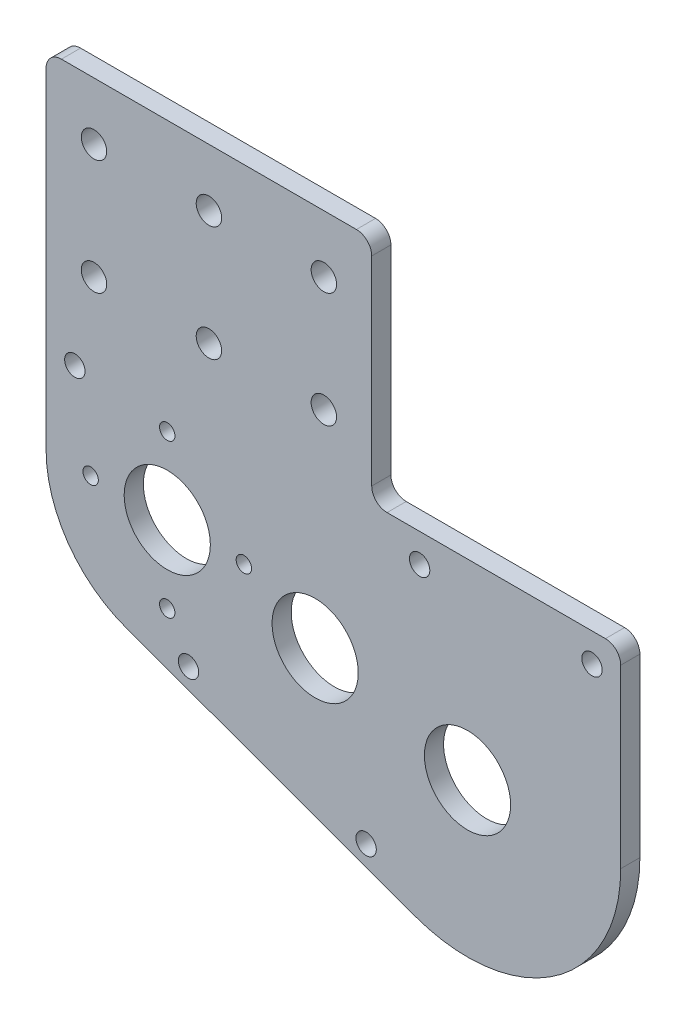
ISO-10303-21;
HEADER;
FILE_DESCRIPTION(('STEP AP214'),'2;1');
FILE_NAME('part.step','',(''),(''),'','','');
FILE_SCHEMA(('AUTOMOTIVE_DESIGN { 1 0 10303 214 1 1 1 1 }'));
ENDSEC;
DATA;
#1=APPLICATION_CONTEXT('core data for automotive mechanical design processes');
#2=APPLICATION_PROTOCOL_DEFINITION('international standard','automotive_design',2000,#1);
#3=PRODUCT_CONTEXT('',#1,'mechanical');
#4=PRODUCT('Part','Part','',(#3));
#5=PRODUCT_RELATED_PRODUCT_CATEGORY('part','',(#4));
#6=PRODUCT_DEFINITION_FORMATION('','',#4);
#7=PRODUCT_DEFINITION_CONTEXT('part definition',#1,'design');
#8=PRODUCT_DEFINITION('design','',#6,#7);
#9=PRODUCT_DEFINITION_SHAPE('','',#8);
#10=(LENGTH_UNIT() NAMED_UNIT(*) SI_UNIT(.MILLI.,.METRE.));
#11=(NAMED_UNIT(*) PLANE_ANGLE_UNIT() SI_UNIT($,.RADIAN.));
#12=(NAMED_UNIT(*) SI_UNIT($,.STERADIAN.) SOLID_ANGLE_UNIT());
#13=UNCERTAINTY_MEASURE_WITH_UNIT(LENGTH_MEASURE(1.E-05),#10,'distance_accuracy_value','');
#14=(GEOMETRIC_REPRESENTATION_CONTEXT(3) GLOBAL_UNCERTAINTY_ASSIGNED_CONTEXT((#13)) GLOBAL_UNIT_ASSIGNED_CONTEXT((#10,
#11,#12)) REPRESENTATION_CONTEXT('',''));
#15=CARTESIAN_POINT('',(0.,0.,0.));
#16=DIRECTION('',(0.,0.,1.));
#17=DIRECTION('',(1.,0.,0.));
#18=AXIS2_PLACEMENT_3D('',#15,#16,#17);
#19=CARTESIAN_POINT('',(50.8,63.5,6.35));
#20=DIRECTION('',(0.,1.,0.));
#21=DIRECTION('',(-1.,0.,0.));
#22=AXIS2_PLACEMENT_3D('',#19,#20,#21);
#23=PLANE('',#22);
#24=DIRECTION('',(-1.,0.,0.));
#25=VECTOR('',#24,1.);
#26=CARTESIAN_POINT('',(50.8,63.5,0.));
#27=LINE('',#26,#25);
#28=CARTESIAN_POINT('',(45.72,63.5,0.));
#29=VERTEX_POINT('',#28);
#30=CARTESIAN_POINT('',(-26.67,63.5,0.));
#31=VERTEX_POINT('',#30);
#32=EDGE_CURVE('E165',#29,#31,#27,.T.);
#33=ORIENTED_EDGE('',*,*,#32,.T.);
#34=DIRECTION('',(0.,0.,-1.));
#35=VECTOR('',#34,1.);
#36=CARTESIAN_POINT('',(-26.67,63.5,0.));
#37=LINE('',#36,#35);
#38=CARTESIAN_POINT('',(-26.67,63.5,6.35));
#39=VERTEX_POINT('',#38);
#40=EDGE_CURVE('E194',#39,#31,#37,.T.);
#41=ORIENTED_EDGE('',*,*,#40,.F.);
#42=DIRECTION('',(-1.,0.,0.));
#43=VECTOR('',#42,1.);
#44=CARTESIAN_POINT('',(50.8,63.5,6.35));
#45=LINE('',#44,#43);
#46=CARTESIAN_POINT('',(45.72,63.5,6.35));
#47=VERTEX_POINT('',#46);
#48=EDGE_CURVE('E141',#47,#39,#45,.T.);
#49=ORIENTED_EDGE('',*,*,#48,.F.);
#50=DIRECTION('',(0.,0.,-1.));
#51=VECTOR('',#50,1.);
#52=CARTESIAN_POINT('',(45.72,63.5,6.35));
#53=LINE('',#52,#51);
#54=EDGE_CURVE('E197',#29,#47,#53,.F.);
#55=ORIENTED_EDGE('',*,*,#54,.F.);
#56=EDGE_LOOP('',(#33,#41,#49,#55));
#57=FACE_BOUND('',#56,.T.);
#58=ADVANCED_FACE('F41',(#57),#23,.T.);
#59=CARTESIAN_POINT('',(50.8,63.5,6.35));
#60=DIRECTION('',(1.,0.,0.));
#61=DIRECTION('',(0.,0.,1.));
#62=AXIS2_PLACEMENT_3D('',#59,#60,#61);
#63=PLANE('',#62);
#64=DIRECTION('',(0.,1.,0.));
#65=VECTOR('',#64,1.);
#66=CARTESIAN_POINT('',(50.8,63.5,6.35));
#67=LINE('',#66,#65);
#68=CARTESIAN_POINT('',(50.8,0.,6.35));
#69=VERTEX_POINT('',#68);
#70=CARTESIAN_POINT('',(50.8,58.42,6.35));
#71=VERTEX_POINT('',#70);
#72=EDGE_CURVE('E176',#69,#71,#67,.T.);
#73=ORIENTED_EDGE('',*,*,#72,.F.);
#74=DIRECTION('',(0.,0.,-1.));
#75=VECTOR('',#74,1.);
#76=CARTESIAN_POINT('',(50.8,0.,6.35));
#77=LINE('',#76,#75);
#78=CARTESIAN_POINT('',(50.8,0.,0.));
#79=VERTEX_POINT('',#78);
#80=EDGE_CURVE('E177',#69,#79,#77,.T.);
#81=ORIENTED_EDGE('',*,*,#80,.T.);
#82=DIRECTION('',(0.,1.,0.));
#83=VECTOR('',#82,1.);
#84=CARTESIAN_POINT('',(50.8,63.5,0.));
#85=LINE('',#84,#83);
#86=CARTESIAN_POINT('',(50.8,58.42,0.));
#87=VERTEX_POINT('',#86);
#88=EDGE_CURVE('E162',#79,#87,#85,.T.);
#89=ORIENTED_EDGE('',*,*,#88,.T.);
#90=DIRECTION('',(0.,0.,-1.));
#91=VECTOR('',#90,1.);
#92=CARTESIAN_POINT('',(50.8,58.42,6.35));
#93=LINE('',#92,#91);
#94=EDGE_CURVE('E180',#71,#87,#93,.T.);
#95=ORIENTED_EDGE('',*,*,#94,.F.);
#96=EDGE_LOOP('',(#73,#81,#89,#95));
#97=FACE_BOUND('',#96,.T.);
#98=ADVANCED_FACE('F247',(#97),#63,.T.);
#99=CARTESIAN_POINT('',(0.,0.,6.35));
#100=DIRECTION('',(0.,0.,-1.));
#101=DIRECTION('',(1.,0.,0.));
#102=AXIS2_PLACEMENT_3D('',#99,#100,#101);
#103=CYLINDRICAL_SURFACE('',#102,50.8);
#104=CARTESIAN_POINT('',(0.,0.,0.));
#105=DIRECTION('',(0.,0.,1.));
#106=DIRECTION('',(-1.,0.,0.));
#107=AXIS2_PLACEMENT_3D('',#104,#105,#106);
#108=CIRCLE('',#107,50.8);
#109=CARTESIAN_POINT('',(-17.3899869073601,-47.7307904330302,0.));
#110=VERTEX_POINT('',#109);
#111=EDGE_CURVE('E174',#110,#79,#108,.T.);
#112=ORIENTED_EDGE('',*,*,#111,.T.);
#113=ORIENTED_EDGE('',*,*,#80,.F.);
#114=CARTESIAN_POINT('',(0.,0.,6.35));
#115=DIRECTION('',(0.,0.,1.));
#116=DIRECTION('',(-1.,0.,0.));
#117=AXIS2_PLACEMENT_3D('',#114,#115,#116);
#118=CIRCLE('',#117,50.8);
#119=CARTESIAN_POINT('',(-17.3899869073601,-47.7307904330302,6.35));
#120=VERTEX_POINT('',#119);
#121=EDGE_CURVE('E151',#120,#69,#118,.T.);
#122=ORIENTED_EDGE('',*,*,#121,.F.);
#123=DIRECTION('',(0.,0.,-1.));
#124=VECTOR('',#123,1.);
#125=CARTESIAN_POINT('',(-17.3899869073601,-47.7307904330302,6.35));
#126=LINE('',#125,#124);
#127=EDGE_CURVE('E181',#120,#110,#126,.T.);
#128=ORIENTED_EDGE('',*,*,#127,.T.);
#129=EDGE_LOOP('',(#112,#113,#122,#128));
#130=FACE_BOUND('',#129,.T.);
#131=ADVANCED_FACE('F251',(#130),#103,.T.);
#132=CARTESIAN_POINT('',(-17.3899869073601,-47.7307904330302,6.35));
#133=DIRECTION('',(-0.342322576916537,-0.939582488839176,0.));
#134=DIRECTION('',(0.939582488839177,-0.342322576916537,0.));
#135=AXIS2_PLACEMENT_3D('',#132,#133,#134);
#136=PLANE('',#135);
#137=DIRECTION('',(0.939582488839176,-0.342322576916537,0.));
#138=VECTOR('',#137,1.);
#139=CARTESIAN_POINT('',(-17.3899869073601,-47.7307904330302,0.));
#140=LINE('',#139,#138);
#141=CARTESIAN_POINT('',(-113.286645892622,-12.7923025286006,0.));
#142=VERTEX_POINT('',#141);
#143=EDGE_CURVE('E172',#142,#110,#140,.T.);
#144=ORIENTED_EDGE('',*,*,#143,.T.);
#145=ORIENTED_EDGE('',*,*,#127,.F.);
#146=DIRECTION('',(0.939582488839176,-0.342322576916537,0.));
#147=VECTOR('',#146,1.);
#148=CARTESIAN_POINT('',(-17.3899869073601,-47.7307904330302,6.35));
#149=LINE('',#148,#147);
#150=CARTESIAN_POINT('',(-113.286645892622,-12.7923025286006,6.35));
#151=VERTEX_POINT('',#150);
#152=EDGE_CURVE('E156',#151,#120,#149,.T.);
#153=ORIENTED_EDGE('',*,*,#152,.F.);
#154=DIRECTION('',(0.,0.,-1.));
#155=VECTOR('',#154,1.);
#156=CARTESIAN_POINT('',(-113.286645892622,-12.7923025286006,6.35));
#157=LINE('',#156,#155);
#158=EDGE_CURVE('E150',#151,#142,#157,.T.);
#159=ORIENTED_EDGE('',*,*,#158,.T.);
#160=EDGE_LOOP('',(#144,#145,#153,#159));
#161=FACE_BOUND('',#160,.T.);
#162=ADVANCED_FACE('F255',(#161),#136,.T.);
#163=CARTESIAN_POINT('',(-99.5384357128441,24.9428,6.35));
#164=DIRECTION('',(0.,0.,-1.));
#165=DIRECTION('',(1.,0.,0.));
#166=AXIS2_PLACEMENT_3D('',#163,#164,#165);
#167=CYLINDRICAL_SURFACE('',#166,40.1615642871559);
#168=CARTESIAN_POINT('',(-99.5384357128441,24.9428,0.));
#169=DIRECTION('',(0.,0.,1.));
#170=DIRECTION('',(-1.,0.,0.));
#171=AXIS2_PLACEMENT_3D('',#168,#169,#170);
#172=CIRCLE('',#171,40.1615642871559);
#173=CARTESIAN_POINT('',(-139.7,24.9428,0.));
#174=VERTEX_POINT('',#173);
#175=EDGE_CURVE('E170',#174,#142,#172,.T.);
#176=ORIENTED_EDGE('',*,*,#175,.T.);
#177=ORIENTED_EDGE('',*,*,#158,.F.);
#178=CARTESIAN_POINT('',(-99.5384357128441,24.9428,6.35));
#179=DIRECTION('',(0.,0.,1.));
#180=DIRECTION('',(-1.,0.,0.));
#181=AXIS2_PLACEMENT_3D('',#178,#179,#180);
#182=CIRCLE('',#181,40.1615642871559);
#183=CARTESIAN_POINT('',(-139.7,24.9428,6.35));
#184=VERTEX_POINT('',#183);
#185=EDGE_CURVE('E133',#184,#151,#182,.T.);
#186=ORIENTED_EDGE('',*,*,#185,.F.);
#187=DIRECTION('',(0.,0.,-1.));
#188=VECTOR('',#187,1.);
#189=CARTESIAN_POINT('',(-139.7,24.9428,6.35));
#190=LINE('',#189,#188);
#191=EDGE_CURVE('E144',#184,#174,#190,.T.);
#192=ORIENTED_EDGE('',*,*,#191,.T.);
#193=EDGE_LOOP('',(#176,#177,#186,#192));
#194=FACE_BOUND('',#193,.T.);
#195=ADVANCED_FACE('F153',(#194),#167,.T.);
#196=CARTESIAN_POINT('',(-139.7,24.9428,6.35));
#197=DIRECTION('',(-1.,0.,0.));
#198=DIRECTION('',(0.,-1.,0.));
#199=AXIS2_PLACEMENT_3D('',#196,#197,#198);
#200=PLANE('',#199);
#201=DIRECTION('',(0.,-1.,0.));
#202=VECTOR('',#201,1.);
#203=CARTESIAN_POINT('',(-139.7,24.9428,0.));
#204=LINE('',#203,#202);
#205=CARTESIAN_POINT('',(-139.7,134.62,0.));
#206=VERTEX_POINT('',#205);
#207=EDGE_CURVE('E147',#206,#174,#204,.T.);
#208=ORIENTED_EDGE('',*,*,#207,.T.);
#209=ORIENTED_EDGE('',*,*,#191,.F.);
#210=DIRECTION('',(0.,-1.,0.));
#211=VECTOR('',#210,1.);
#212=CARTESIAN_POINT('',(-139.7,24.9428,6.35));
#213=LINE('',#212,#211);
#214=CARTESIAN_POINT('',(-139.7,134.62,6.35));
#215=VERTEX_POINT('',#214);
#216=EDGE_CURVE('E128',#215,#184,#213,.T.);
#217=ORIENTED_EDGE('',*,*,#216,.F.);
#218=DIRECTION('',(0.,0.,-1.));
#219=VECTOR('',#218,1.);
#220=CARTESIAN_POINT('',(-139.7,134.62,6.35));
#221=LINE('',#220,#219);
#222=EDGE_CURVE('E211',#206,#215,#221,.F.);
#223=ORIENTED_EDGE('',*,*,#222,.F.);
#224=EDGE_LOOP('',(#208,#209,#217,#223));
#225=FACE_BOUND('',#224,.T.);
#226=ADVANCED_FACE('F145',(#225),#200,.T.);
#227=CARTESIAN_POINT('',(0.,0.,6.35));
#228=DIRECTION('',(0.,0.,1.));
#229=DIRECTION('',(-1.,0.,0.));
#230=AXIS2_PLACEMENT_3D('',#227,#228,#229);
#231=PLANE('',#230);
#232=CARTESIAN_POINT('',(-47.625,82.55,6.35));
#233=DIRECTION('',(0.,0.,-1.));
#234=DIRECTION('',(-1.,0.,0.));
#235=AXIS2_PLACEMENT_3D('',#232,#233,#234);
#236=CIRCLE('',#235,4.21640000000001);
#237=CARTESIAN_POINT('',(-51.8414,82.55,6.35));
#238=VERTEX_POINT('',#237);
#239=EDGE_CURVE('E307',#238,#238,#236,.F.);
#240=ORIENTED_EDGE('',*,*,#239,.F.);
#241=EDGE_LOOP('',(#240));
#242=FACE_BOUND('',#241,.T.);
#243=CARTESIAN_POINT('',(-85.725,82.55,6.35));
#244=DIRECTION('',(0.,0.,-1.));
#245=DIRECTION('',(-1.,0.,0.));
#246=AXIS2_PLACEMENT_3D('',#243,#244,#245);
#247=CIRCLE('',#246,4.21639999999999);
#248=CARTESIAN_POINT('',(-89.9414,82.55,6.35));
#249=VERTEX_POINT('',#248);
#250=EDGE_CURVE('E311',#249,#249,#247,.F.);
#251=ORIENTED_EDGE('',*,*,#250,.F.);
#252=EDGE_LOOP('',(#251));
#253=FACE_BOUND('',#252,.T.);
#254=CARTESIAN_POINT('',(-85.725,120.65,6.35));
#255=DIRECTION('',(0.,0.,-1.));
#256=DIRECTION('',(-1.,0.,0.));
#257=AXIS2_PLACEMENT_3D('',#254,#255,#256);
#258=CIRCLE('',#257,4.21639999999999);
#259=CARTESIAN_POINT('',(-89.9414,120.65,6.35));
#260=VERTEX_POINT('',#259);
#261=EDGE_CURVE('E315',#260,#260,#258,.F.);
#262=ORIENTED_EDGE('',*,*,#261,.F.);
#263=EDGE_LOOP('',(#262));
#264=FACE_BOUND('',#263,.T.);
#265=CARTESIAN_POINT('',(-123.825,82.55,6.35));
#266=DIRECTION('',(0.,0.,-1.));
#267=DIRECTION('',(-1.,0.,0.));
#268=AXIS2_PLACEMENT_3D('',#265,#266,#267);
#269=CIRCLE('',#268,4.21639999999999);
#270=CARTESIAN_POINT('',(-128.0414,82.55,6.35));
#271=VERTEX_POINT('',#270);
#272=EDGE_CURVE('E319',#271,#271,#269,.F.);
#273=ORIENTED_EDGE('',*,*,#272,.F.);
#274=EDGE_LOOP('',(#273));
#275=FACE_BOUND('',#274,.T.);
#276=CARTESIAN_POINT('',(-47.625,120.65,6.35));
#277=DIRECTION('',(0.,0.,-1.));
#278=DIRECTION('',(-1.,0.,0.));
#279=AXIS2_PLACEMENT_3D('',#276,#277,#278);
#280=CIRCLE('',#279,4.21640000000001);
#281=CARTESIAN_POINT('',(-51.8414,120.65,6.35));
#282=VERTEX_POINT('',#281);
#283=EDGE_CURVE('E323',#282,#282,#280,.F.);
#284=ORIENTED_EDGE('',*,*,#283,.F.);
#285=EDGE_LOOP('',(#284));
#286=FACE_BOUND('',#285,.T.);
#287=CARTESIAN_POINT('',(-123.825,120.65,6.35));
#288=DIRECTION('',(0.,0.,-1.));
#289=DIRECTION('',(-1.,0.,0.));
#290=AXIS2_PLACEMENT_3D('',#287,#288,#289);
#291=CIRCLE('',#290,4.21639999999999);
#292=CARTESIAN_POINT('',(-128.0414,120.65,6.35));
#293=VERTEX_POINT('',#292);
#294=EDGE_CURVE('E327',#293,#293,#291,.F.);
#295=ORIENTED_EDGE('',*,*,#294,.F.);
#296=EDGE_LOOP('',(#295));
#297=FACE_BOUND('',#296,.T.);
#298=CARTESIAN_POINT('',(-33.6126326232561,-35.061995487122,6.35));
#299=DIRECTION('',(0.,0.,1.));
#300=DIRECTION('',(1.,0.,0.));
#301=AXIS2_PLACEMENT_3D('',#298,#299,#300);
#302=CIRCLE('',#301,3.3782);
#303=CARTESIAN_POINT('',(-30.2344326232561,-35.061995487122,6.35));
#304=VERTEX_POINT('',#303);
#305=EDGE_CURVE('E331',#304,#304,#302,.T.);
#306=ORIENTED_EDGE('',*,*,#305,.F.);
#307=EDGE_LOOP('',(#306));
#308=FACE_BOUND('',#307,.T.);
#309=CARTESIAN_POINT('',(-92.482563874237,-13.6136321894695,6.35));
#310=DIRECTION('',(0.,0.,1.));
#311=DIRECTION('',(1.,0.,0.));
#312=AXIS2_PLACEMENT_3D('',#309,#310,#311);
#313=CIRCLE('',#312,3.3782);
#314=CARTESIAN_POINT('',(-89.104363874237,-13.6136321894695,6.35));
#315=VERTEX_POINT('',#314);
#316=EDGE_CURVE('E335',#315,#315,#313,.T.);
#317=ORIENTED_EDGE('',*,*,#316,.F.);
#318=EDGE_LOOP('',(#317));
#319=FACE_BOUND('',#318,.T.);
#320=CARTESIAN_POINT('',(-130.175,53.975,6.35));
#321=DIRECTION('',(0.,0.,1.));
#322=DIRECTION('',(1.,0.,0.));
#323=AXIS2_PLACEMENT_3D('',#320,#321,#322);
#324=CIRCLE('',#323,3.3782);
#325=CARTESIAN_POINT('',(-126.7968,53.975,6.35));
#326=VERTEX_POINT('',#325);
#327=EDGE_CURVE('E339',#326,#326,#324,.T.);
#328=ORIENTED_EDGE('',*,*,#327,.F.);
#329=EDGE_LOOP('',(#328));
#330=FACE_BOUND('',#329,.T.);
#331=CARTESIAN_POINT('',(-15.875,53.975,6.35));
#332=DIRECTION('',(0.,0.,1.));
#333=DIRECTION('',(1.,0.,0.));
#334=AXIS2_PLACEMENT_3D('',#331,#332,#333);
#335=CIRCLE('',#334,3.3782);
#336=CARTESIAN_POINT('',(-12.4968,53.975,6.35));
#337=VERTEX_POINT('',#336);
#338=EDGE_CURVE('E343',#337,#337,#335,.T.);
#339=ORIENTED_EDGE('',*,*,#338,.F.);
#340=EDGE_LOOP('',(#339));
#341=FACE_BOUND('',#340,.T.);
#342=CARTESIAN_POINT('',(41.275,53.975,6.35));
#343=DIRECTION('',(0.,0.,1.));
#344=DIRECTION('',(1.,0.,0.));
#345=AXIS2_PLACEMENT_3D('',#342,#343,#344);
#346=CIRCLE('',#345,3.3782);
#347=CARTESIAN_POINT('',(44.6532,53.975,6.35));
#348=VERTEX_POINT('',#347);
#349=EDGE_CURVE('E347',#348,#348,#346,.T.);
#350=ORIENTED_EDGE('',*,*,#349,.F.);
#351=EDGE_LOOP('',(#350));
#352=FACE_BOUND('',#351,.T.);
#353=CARTESIAN_POINT('',(-124.938435712844,24.9428,6.35));
#354=DIRECTION('',(0.,0.,1.));
#355=DIRECTION('',(1.,0.,0.));
#356=AXIS2_PLACEMENT_3D('',#353,#354,#355);
#357=CIRCLE('',#356,2.55269999999999);
#358=CARTESIAN_POINT('',(-122.385735712844,24.9428,6.35));
#359=VERTEX_POINT('',#358);
#360=EDGE_CURVE('E351',#359,#359,#357,.T.);
#361=ORIENTED_EDGE('',*,*,#360,.F.);
#362=EDGE_LOOP('',(#361));
#363=FACE_BOUND('',#362,.T.);
#364=CARTESIAN_POINT('',(-99.5384357128441,50.3428,6.35));
#365=DIRECTION('',(0.,0.,1.));
#366=DIRECTION('',(1.,0.,0.));
#367=AXIS2_PLACEMENT_3D('',#364,#365,#366);
#368=CIRCLE('',#367,2.55269999999999);
#369=CARTESIAN_POINT('',(-96.9857357128441,50.3428,6.35));
#370=VERTEX_POINT('',#369);
#371=EDGE_CURVE('E355',#370,#370,#368,.T.);
#372=ORIENTED_EDGE('',*,*,#371,.F.);
#373=EDGE_LOOP('',(#372));
#374=FACE_BOUND('',#373,.T.);
#375=CARTESIAN_POINT('',(-74.1384357128441,24.9428,6.35));
#376=DIRECTION('',(0.,0.,1.));
#377=DIRECTION('',(1.,0.,0.));
#378=AXIS2_PLACEMENT_3D('',#375,#376,#377);
#379=CIRCLE('',#378,2.55269999999999);
#380=CARTESIAN_POINT('',(-71.5857357128441,24.9428,6.35));
#381=VERTEX_POINT('',#380);
#382=EDGE_CURVE('E359',#381,#381,#379,.T.);
#383=ORIENTED_EDGE('',*,*,#382,.F.);
#384=EDGE_LOOP('',(#383));
#385=FACE_BOUND('',#384,.T.);
#386=CARTESIAN_POINT('',(-99.5384357128441,-0.457199999999998,6.35));
#387=DIRECTION('',(0.,0.,1.));
#388=DIRECTION('',(1.,0.,0.));
#389=AXIS2_PLACEMENT_3D('',#386,#387,#388);
#390=CIRCLE('',#389,2.55269999999999);
#391=CARTESIAN_POINT('',(-96.9857357128441,-0.457199999999998,6.35));
#392=VERTEX_POINT('',#391);
#393=EDGE_CURVE('E363',#392,#392,#390,.T.);
#394=ORIENTED_EDGE('',*,*,#393,.F.);
#395=EDGE_LOOP('',(#394));
#396=FACE_BOUND('',#395,.T.);
#397=CARTESIAN_POINT('',(0.,0.,6.35));
#398=DIRECTION('',(0.,0.,-1.));
#399=DIRECTION('',(-1.,0.,0.));
#400=AXIS2_PLACEMENT_3D('',#397,#398,#399);
#401=CIRCLE('',#400,14.2875);
#402=CARTESIAN_POINT('',(-14.2875,0.,6.35));
#403=VERTEX_POINT('',#402);
#404=EDGE_CURVE('E229',#403,#403,#401,.F.);
#405=ORIENTED_EDGE('',*,*,#404,.F.);
#406=EDGE_LOOP('',(#405));
#407=FACE_BOUND('',#406,.T.);
#408=CARTESIAN_POINT('',(-50.5083646562699,12.6566188118812,6.35));
#409=DIRECTION('',(0.,0.,-1.));
#410=DIRECTION('',(-1.,0.,0.));
#411=AXIS2_PLACEMENT_3D('',#408,#409,#410);
#412=CIRCLE('',#411,14.2875);
#413=CARTESIAN_POINT('',(-64.7958646562699,12.6566188118812,6.35));
#414=VERTEX_POINT('',#413);
#415=EDGE_CURVE('E370',#414,#414,#412,.F.);
#416=ORIENTED_EDGE('',*,*,#415,.F.);
#417=EDGE_LOOP('',(#416));
#418=FACE_BOUND('',#417,.T.);
#419=CARTESIAN_POINT('',(-99.5384357128441,24.9428,6.35));
#420=DIRECTION('',(0.,0.,-1.));
#421=DIRECTION('',(-1.,0.,0.));
#422=AXIS2_PLACEMENT_3D('',#419,#420,#421);
#423=CIRCLE('',#422,14.2875);
#424=CARTESIAN_POINT('',(-113.825935712844,24.9428,6.35));
#425=VERTEX_POINT('',#424);
#426=EDGE_CURVE('E373',#425,#425,#423,.F.);
#427=ORIENTED_EDGE('',*,*,#426,.F.);
#428=EDGE_LOOP('',(#427));
#429=FACE_BOUND('',#428,.T.);
#430=ORIENTED_EDGE('',*,*,#48,.T.);
#431=CARTESIAN_POINT('',(-26.67,68.58,6.35));
#432=DIRECTION('',(0.,0.,-1.));
#433=DIRECTION('',(-1.,0.,0.));
#434=AXIS2_PLACEMENT_3D('',#431,#432,#433);
#435=CIRCLE('',#434,5.08);
#436=CARTESIAN_POINT('',(-31.75,68.58,6.34999999999999));
#437=VERTEX_POINT('',#436);
#438=EDGE_CURVE('E11',#437,#39,#435,.F.);
#439=ORIENTED_EDGE('',*,*,#438,.F.);
#440=DIRECTION('',(0.,1.,0.));
#441=VECTOR('',#440,1.);
#442=CARTESIAN_POINT('',(-31.75,139.7,6.34999999999999));
#443=LINE('',#442,#441);
#444=CARTESIAN_POINT('',(-31.75,134.62,6.34999999999999));
#445=VERTEX_POINT('',#444);
#446=EDGE_CURVE('E226',#437,#445,#443,.T.);
#447=ORIENTED_EDGE('',*,*,#446,.T.);
#448=CARTESIAN_POINT('',(-36.83,134.62,6.34999999999999));
#449=DIRECTION('',(0.,0.,-1.));
#450=DIRECTION('',(-1.,0.,0.));
#451=AXIS2_PLACEMENT_3D('',#448,#449,#450);
#452=CIRCLE('',#451,5.08);
#453=CARTESIAN_POINT('',(-36.83,139.7,6.34999999999999));
#454=VERTEX_POINT('',#453);
#455=EDGE_CURVE('E201',#454,#445,#452,.T.);
#456=ORIENTED_EDGE('',*,*,#455,.F.);
#457=DIRECTION('',(-1.,0.,0.));
#458=VECTOR('',#457,1.);
#459=CARTESIAN_POINT('',(-139.7,139.7,6.34999999999999));
#460=LINE('',#459,#458);
#461=CARTESIAN_POINT('',(-134.62,139.7,6.34999999999999));
#462=VERTEX_POINT('',#461);
#463=EDGE_CURVE('E166',#454,#462,#460,.T.);
#464=ORIENTED_EDGE('',*,*,#463,.T.);
#465=CARTESIAN_POINT('',(-134.62,134.62,6.34999999999999));
#466=DIRECTION('',(0.,0.,-1.));
#467=DIRECTION('',(-1.,0.,0.));
#468=AXIS2_PLACEMENT_3D('',#465,#466,#467);
#469=CIRCLE('',#468,5.08);
#470=EDGE_CURVE('E137',#215,#462,#469,.T.);
#471=ORIENTED_EDGE('',*,*,#470,.F.);
#472=ORIENTED_EDGE('',*,*,#216,.T.);
#473=ORIENTED_EDGE('',*,*,#185,.T.);
#474=ORIENTED_EDGE('',*,*,#152,.T.);
#475=ORIENTED_EDGE('',*,*,#121,.T.);
#476=ORIENTED_EDGE('',*,*,#72,.T.);
#477=CARTESIAN_POINT('',(45.72,58.42,6.35));
#478=DIRECTION('',(0.,0.,-1.));
#479=DIRECTION('',(-1.,0.,0.));
#480=AXIS2_PLACEMENT_3D('',#477,#478,#479);
#481=CIRCLE('',#480,5.08);
#482=EDGE_CURVE('E203',#47,#71,#481,.T.);
#483=ORIENTED_EDGE('',*,*,#482,.F.);
#484=EDGE_LOOP('',(#430,#439,#447,#456,#464,#471,#472,#473,#474,#475,#476,#483));
#485=FACE_BOUND('',#484,.T.);
#486=ADVANCED_FACE('F131',(#242,#253,#264,#275,#286,#297,#308,#319,#330,#341,#352,#363,#374,
#385,#396,#407,#418,#429,#485),#231,.T.);
#487=CARTESIAN_POINT('',(0.,0.,0.));
#488=DIRECTION('',(0.,0.,1.));
#489=DIRECTION('',(-1.,0.,0.));
#490=AXIS2_PLACEMENT_3D('',#487,#488,#489);
#491=PLANE('',#490);
#492=CARTESIAN_POINT('',(-47.625,82.55,0.));
#493=DIRECTION('',(0.,0.,1.));
#494=DIRECTION('',(1.,0.,0.));
#495=AXIS2_PLACEMENT_3D('',#492,#493,#494);
#496=CIRCLE('',#495,4.21640000000001);
#497=CARTESIAN_POINT('',(-43.4086,82.55,0.));
#498=VERTEX_POINT('',#497);
#499=EDGE_CURVE('E434',#498,#498,#496,.T.);
#500=ORIENTED_EDGE('',*,*,#499,.T.);
#501=EDGE_LOOP('',(#500));
#502=FACE_BOUND('',#501,.T.);
#503=CARTESIAN_POINT('',(-85.725,82.55,0.));
#504=DIRECTION('',(0.,0.,1.));
#505=DIRECTION('',(1.,0.,0.));
#506=AXIS2_PLACEMENT_3D('',#503,#504,#505);
#507=CIRCLE('',#506,4.21639999999999);
#508=CARTESIAN_POINT('',(-81.5086,82.55,0.));
#509=VERTEX_POINT('',#508);
#510=EDGE_CURVE('E433',#509,#509,#507,.T.);
#511=ORIENTED_EDGE('',*,*,#510,.T.);
#512=EDGE_LOOP('',(#511));
#513=FACE_BOUND('',#512,.T.);
#514=CARTESIAN_POINT('',(-85.725,120.65,0.));
#515=DIRECTION('',(0.,0.,1.));
#516=DIRECTION('',(1.,0.,0.));
#517=AXIS2_PLACEMENT_3D('',#514,#515,#516);
#518=CIRCLE('',#517,4.21639999999999);
#519=CARTESIAN_POINT('',(-81.5086,120.65,0.));
#520=VERTEX_POINT('',#519);
#521=EDGE_CURVE('E426',#520,#520,#518,.T.);
#522=ORIENTED_EDGE('',*,*,#521,.T.);
#523=EDGE_LOOP('',(#522));
#524=FACE_BOUND('',#523,.T.);
#525=CARTESIAN_POINT('',(-123.825,82.55,0.));
#526=DIRECTION('',(0.,0.,1.));
#527=DIRECTION('',(1.,0.,0.));
#528=AXIS2_PLACEMENT_3D('',#525,#526,#527);
#529=CIRCLE('',#528,4.21639999999999);
#530=CARTESIAN_POINT('',(-119.6086,82.55,0.));
#531=VERTEX_POINT('',#530);
#532=EDGE_CURVE('E425',#531,#531,#529,.T.);
#533=ORIENTED_EDGE('',*,*,#532,.T.);
#534=EDGE_LOOP('',(#533));
#535=FACE_BOUND('',#534,.T.);
#536=CARTESIAN_POINT('',(-47.625,120.65,0.));
#537=DIRECTION('',(0.,0.,1.));
#538=DIRECTION('',(1.,0.,0.));
#539=AXIS2_PLACEMENT_3D('',#536,#537,#538);
#540=CIRCLE('',#539,4.21640000000001);
#541=CARTESIAN_POINT('',(-43.4086,120.65,0.));
#542=VERTEX_POINT('',#541);
#543=EDGE_CURVE('E441',#542,#542,#540,.T.);
#544=ORIENTED_EDGE('',*,*,#543,.T.);
#545=EDGE_LOOP('',(#544));
#546=FACE_BOUND('',#545,.T.);
#547=CARTESIAN_POINT('',(-123.825,120.65,0.));
#548=DIRECTION('',(0.,0.,1.));
#549=DIRECTION('',(1.,0.,0.));
#550=AXIS2_PLACEMENT_3D('',#547,#548,#549);
#551=CIRCLE('',#550,4.21639999999999);
#552=CARTESIAN_POINT('',(-119.6086,120.65,0.));
#553=VERTEX_POINT('',#552);
#554=EDGE_CURVE('E421',#553,#553,#551,.T.);
#555=ORIENTED_EDGE('',*,*,#554,.T.);
#556=EDGE_LOOP('',(#555));
#557=FACE_BOUND('',#556,.T.);
#558=CARTESIAN_POINT('',(-33.6126326232561,-35.061995487122,0.));
#559=DIRECTION('',(0.,0.,1.));
#560=DIRECTION('',(1.,0.,0.));
#561=AXIS2_PLACEMENT_3D('',#558,#559,#560);
#562=CIRCLE('',#561,3.3782);
#563=CARTESIAN_POINT('',(-30.2344326232561,-35.061995487122,0.));
#564=VERTEX_POINT('',#563);
#565=EDGE_CURVE('E417',#564,#564,#562,.T.);
#566=ORIENTED_EDGE('',*,*,#565,.T.);
#567=EDGE_LOOP('',(#566));
#568=FACE_BOUND('',#567,.T.);
#569=CARTESIAN_POINT('',(-92.482563874237,-13.6136321894695,0.));
#570=DIRECTION('',(0.,0.,1.));
#571=DIRECTION('',(1.,0.,0.));
#572=AXIS2_PLACEMENT_3D('',#569,#570,#571);
#573=CIRCLE('',#572,3.3782);
#574=CARTESIAN_POINT('',(-89.104363874237,-13.6136321894695,0.));
#575=VERTEX_POINT('',#574);
#576=EDGE_CURVE('E413',#575,#575,#573,.T.);
#577=ORIENTED_EDGE('',*,*,#576,.T.);
#578=EDGE_LOOP('',(#577));
#579=FACE_BOUND('',#578,.T.);
#580=CARTESIAN_POINT('',(-130.175,53.975,0.));
#581=DIRECTION('',(0.,0.,1.));
#582=DIRECTION('',(1.,0.,0.));
#583=AXIS2_PLACEMENT_3D('',#580,#581,#582);
#584=CIRCLE('',#583,3.3782);
#585=CARTESIAN_POINT('',(-126.7968,53.975,0.));
#586=VERTEX_POINT('',#585);
#587=EDGE_CURVE('E409',#586,#586,#584,.T.);
#588=ORIENTED_EDGE('',*,*,#587,.T.);
#589=EDGE_LOOP('',(#588));
#590=FACE_BOUND('',#589,.T.);
#591=CARTESIAN_POINT('',(-15.875,53.975,0.));
#592=DIRECTION('',(0.,0.,1.));
#593=DIRECTION('',(1.,0.,0.));
#594=AXIS2_PLACEMENT_3D('',#591,#592,#593);
#595=CIRCLE('',#594,3.3782);
#596=CARTESIAN_POINT('',(-12.4968,53.975,0.));
#597=VERTEX_POINT('',#596);
#598=EDGE_CURVE('E405',#597,#597,#595,.T.);
#599=ORIENTED_EDGE('',*,*,#598,.T.);
#600=EDGE_LOOP('',(#599));
#601=FACE_BOUND('',#600,.T.);
#602=CARTESIAN_POINT('',(41.275,53.975,0.));
#603=DIRECTION('',(0.,0.,1.));
#604=DIRECTION('',(1.,0.,0.));
#605=AXIS2_PLACEMENT_3D('',#602,#603,#604);
#606=CIRCLE('',#605,3.3782);
#607=CARTESIAN_POINT('',(44.6532,53.975,0.));
#608=VERTEX_POINT('',#607);
#609=EDGE_CURVE('E401',#608,#608,#606,.T.);
#610=ORIENTED_EDGE('',*,*,#609,.T.);
#611=EDGE_LOOP('',(#610));
#612=FACE_BOUND('',#611,.T.);
#613=CARTESIAN_POINT('',(-124.938435712844,24.9428,0.));
#614=DIRECTION('',(0.,0.,1.));
#615=DIRECTION('',(1.,0.,0.));
#616=AXIS2_PLACEMENT_3D('',#613,#614,#615);
#617=CIRCLE('',#616,2.55269999999999);
#618=CARTESIAN_POINT('',(-122.385735712844,24.9428,0.));
#619=VERTEX_POINT('',#618);
#620=EDGE_CURVE('E397',#619,#619,#617,.T.);
#621=ORIENTED_EDGE('',*,*,#620,.T.);
#622=EDGE_LOOP('',(#621));
#623=FACE_BOUND('',#622,.T.);
#624=CARTESIAN_POINT('',(-99.5384357128441,50.3428,0.));
#625=DIRECTION('',(0.,0.,1.));
#626=DIRECTION('',(1.,0.,0.));
#627=AXIS2_PLACEMENT_3D('',#624,#625,#626);
#628=CIRCLE('',#627,2.55269999999999);
#629=CARTESIAN_POINT('',(-96.9857357128441,50.3428,0.));
#630=VERTEX_POINT('',#629);
#631=EDGE_CURVE('E393',#630,#630,#628,.T.);
#632=ORIENTED_EDGE('',*,*,#631,.T.);
#633=EDGE_LOOP('',(#632));
#634=FACE_BOUND('',#633,.T.);
#635=CARTESIAN_POINT('',(-74.1384357128441,24.9428,0.));
#636=DIRECTION('',(0.,0.,1.));
#637=DIRECTION('',(1.,0.,0.));
#638=AXIS2_PLACEMENT_3D('',#635,#636,#637);
#639=CIRCLE('',#638,2.55269999999999);
#640=CARTESIAN_POINT('',(-71.5857357128441,24.9428,0.));
#641=VERTEX_POINT('',#640);
#642=EDGE_CURVE('E389',#641,#641,#639,.T.);
#643=ORIENTED_EDGE('',*,*,#642,.T.);
#644=EDGE_LOOP('',(#643));
#645=FACE_BOUND('',#644,.T.);
#646=CARTESIAN_POINT('',(-99.5384357128441,-0.457199999999998,0.));
#647=DIRECTION('',(0.,0.,1.));
#648=DIRECTION('',(1.,0.,0.));
#649=AXIS2_PLACEMENT_3D('',#646,#647,#648);
#650=CIRCLE('',#649,2.55269999999999);
#651=CARTESIAN_POINT('',(-96.9857357128441,-0.457199999999998,0.));
#652=VERTEX_POINT('',#651);
#653=EDGE_CURVE('E385',#652,#652,#650,.T.);
#654=ORIENTED_EDGE('',*,*,#653,.T.);
#655=EDGE_LOOP('',(#654));
#656=FACE_BOUND('',#655,.T.);
#657=CARTESIAN_POINT('',(0.,0.,0.));
#658=DIRECTION('',(0.,0.,1.));
#659=DIRECTION('',(1.,0.,0.));
#660=AXIS2_PLACEMENT_3D('',#657,#658,#659);
#661=CIRCLE('',#660,14.2875);
#662=CARTESIAN_POINT('',(14.2875,0.,0.));
#663=VERTEX_POINT('',#662);
#664=EDGE_CURVE('E223',#663,#663,#661,.T.);
#665=ORIENTED_EDGE('',*,*,#664,.T.);
#666=EDGE_LOOP('',(#665));
#667=FACE_BOUND('',#666,.T.);
#668=CARTESIAN_POINT('',(-50.5083646562699,12.6566188118812,0.));
#669=DIRECTION('',(0.,0.,1.));
#670=DIRECTION('',(1.,0.,0.));
#671=AXIS2_PLACEMENT_3D('',#668,#669,#670);
#672=CIRCLE('',#671,14.2875);
#673=CARTESIAN_POINT('',(-36.2208646562699,12.6566188118812,0.));
#674=VERTEX_POINT('',#673);
#675=EDGE_CURVE('E375',#674,#674,#672,.T.);
#676=ORIENTED_EDGE('',*,*,#675,.T.);
#677=EDGE_LOOP('',(#676));
#678=FACE_BOUND('',#677,.T.);
#679=CARTESIAN_POINT('',(-99.5384357128441,24.9428,0.));
#680=DIRECTION('',(0.,0.,1.));
#681=DIRECTION('',(1.,0.,0.));
#682=AXIS2_PLACEMENT_3D('',#679,#680,#681);
#683=CIRCLE('',#682,14.2875);
#684=CARTESIAN_POINT('',(-85.2509357128441,24.9428,0.));
#685=VERTEX_POINT('',#684);
#686=EDGE_CURVE('E376',#685,#685,#683,.T.);
#687=ORIENTED_EDGE('',*,*,#686,.T.);
#688=EDGE_LOOP('',(#687));
#689=FACE_BOUND('',#688,.T.);
#690=ORIENTED_EDGE('',*,*,#88,.F.);
#691=ORIENTED_EDGE('',*,*,#111,.F.);
#692=ORIENTED_EDGE('',*,*,#143,.F.);
#693=ORIENTED_EDGE('',*,*,#175,.F.);
#694=ORIENTED_EDGE('',*,*,#207,.F.);
#695=CARTESIAN_POINT('',(-134.62,134.62,0.));
#696=DIRECTION('',(0.,0.,-1.));
#697=DIRECTION('',(-1.,0.,0.));
#698=AXIS2_PLACEMENT_3D('',#695,#696,#697);
#699=CIRCLE('',#698,5.08);
#700=CARTESIAN_POINT('',(-134.62,139.7,0.));
#701=VERTEX_POINT('',#700);
#702=EDGE_CURVE('E187',#701,#206,#699,.F.);
#703=ORIENTED_EDGE('',*,*,#702,.F.);
#704=DIRECTION('',(-1.,0.,0.));
#705=VECTOR('',#704,1.);
#706=CARTESIAN_POINT('',(-139.7,139.7,0.));
#707=LINE('',#706,#705);
#708=CARTESIAN_POINT('',(-36.83,139.7,0.));
#709=VERTEX_POINT('',#708);
#710=EDGE_CURVE('E222',#709,#701,#707,.T.);
#711=ORIENTED_EDGE('',*,*,#710,.F.);
#712=CARTESIAN_POINT('',(-36.83,134.62,0.));
#713=DIRECTION('',(0.,0.,-1.));
#714=DIRECTION('',(-1.,0.,0.));
#715=AXIS2_PLACEMENT_3D('',#712,#713,#714);
#716=CIRCLE('',#715,5.08);
#717=CARTESIAN_POINT('',(-31.75,134.62,0.));
#718=VERTEX_POINT('',#717);
#719=EDGE_CURVE('E189',#718,#709,#716,.F.);
#720=ORIENTED_EDGE('',*,*,#719,.F.);
#721=DIRECTION('',(0.,1.,0.));
#722=VECTOR('',#721,1.);
#723=CARTESIAN_POINT('',(-31.75,139.7,0.));
#724=LINE('',#723,#722);
#725=CARTESIAN_POINT('',(-31.75,68.58,0.));
#726=VERTEX_POINT('',#725);
#727=EDGE_CURVE('E218',#726,#718,#724,.T.);
#728=ORIENTED_EDGE('',*,*,#727,.F.);
#729=CARTESIAN_POINT('',(-26.67,68.58,0.));
#730=DIRECTION('',(0.,0.,-1.));
#731=DIRECTION('',(-1.,0.,0.));
#732=AXIS2_PLACEMENT_3D('',#729,#730,#731);
#733=CIRCLE('',#732,5.08);
#734=EDGE_CURVE('E49',#31,#726,#733,.T.);
#735=ORIENTED_EDGE('',*,*,#734,.F.);
#736=ORIENTED_EDGE('',*,*,#32,.F.);
#737=CARTESIAN_POINT('',(45.72,58.42,0.));
#738=DIRECTION('',(0.,0.,-1.));
#739=DIRECTION('',(-1.,0.,0.));
#740=AXIS2_PLACEMENT_3D('',#737,#738,#739);
#741=CIRCLE('',#740,5.08);
#742=EDGE_CURVE('E192',#87,#29,#741,.F.);
#743=ORIENTED_EDGE('',*,*,#742,.F.);
#744=EDGE_LOOP('',(#690,#691,#692,#693,#694,#703,#711,#720,#728,#735,#736,#743));
#745=FACE_BOUND('',#744,.T.);
#746=ADVANCED_FACE('F220',(#502,#513,#524,#535,#546,#557,#568,#579,#590,#601,#612,#623,#634,
#645,#656,#667,#678,#689,#745),#491,.F.);
#747=CARTESIAN_POINT('',(-31.75,139.7,138.484940496449));
#748=DIRECTION('',(1.,0.,0.));
#749=DIRECTION('',(0.,1.,0.));
#750=AXIS2_PLACEMENT_3D('',#747,#748,#749);
#751=PLANE('',#750);
#752=ORIENTED_EDGE('',*,*,#727,.T.);
#753=DIRECTION('',(0.,0.,-1.));
#754=VECTOR('',#753,1.);
#755=CARTESIAN_POINT('',(-31.75,134.62,138.484940496449));
#756=LINE('',#755,#754);
#757=EDGE_CURVE('E56',#445,#718,#756,.T.);
#758=ORIENTED_EDGE('',*,*,#757,.F.);
#759=ORIENTED_EDGE('',*,*,#446,.F.);
#760=DIRECTION('',(0.,0.,-1.));
#761=VECTOR('',#760,1.);
#762=CARTESIAN_POINT('',(-31.75,68.58,6.34999999999999));
#763=LINE('',#762,#761);
#764=EDGE_CURVE('E63',#726,#437,#763,.F.);
#765=ORIENTED_EDGE('',*,*,#764,.F.);
#766=EDGE_LOOP('',(#752,#758,#759,#765));
#767=FACE_BOUND('',#766,.T.);
#768=ADVANCED_FACE('F286',(#767),#751,.T.);
#769=CARTESIAN_POINT('',(-139.7,139.7,138.484940496449));
#770=DIRECTION('',(0.,1.,0.));
#771=DIRECTION('',(0.,0.,-1.));
#772=AXIS2_PLACEMENT_3D('',#769,#770,#771);
#773=PLANE('',#772);
#774=ORIENTED_EDGE('',*,*,#710,.T.);
#775=DIRECTION('',(0.,0.,-1.));
#776=VECTOR('',#775,1.);
#777=CARTESIAN_POINT('',(-134.62,139.7,138.484940496449));
#778=LINE('',#777,#776);
#779=EDGE_CURVE('E207',#462,#701,#778,.T.);
#780=ORIENTED_EDGE('',*,*,#779,.F.);
#781=ORIENTED_EDGE('',*,*,#463,.F.);
#782=DIRECTION('',(0.,0.,-1.));
#783=VECTOR('',#782,1.);
#784=CARTESIAN_POINT('',(-36.83,139.7,138.484940496449));
#785=LINE('',#784,#783);
#786=EDGE_CURVE('E209',#709,#454,#785,.F.);
#787=ORIENTED_EDGE('',*,*,#786,.F.);
#788=EDGE_LOOP('',(#774,#780,#781,#787));
#789=FACE_BOUND('',#788,.T.);
#790=ADVANCED_FACE('F274',(#789),#773,.T.);
#791=CARTESIAN_POINT('',(45.72,58.42,6.35));
#792=DIRECTION('',(0.,0.,-1.));
#793=DIRECTION('',(1.,0.,0.));
#794=AXIS2_PLACEMENT_3D('',#791,#792,#793);
#795=CYLINDRICAL_SURFACE('',#794,5.08);
#796=ORIENTED_EDGE('',*,*,#482,.T.);
#797=ORIENTED_EDGE('',*,*,#94,.T.);
#798=ORIENTED_EDGE('',*,*,#742,.T.);
#799=ORIENTED_EDGE('',*,*,#54,.T.);
#800=EDGE_LOOP('',(#796,#797,#798,#799));
#801=FACE_BOUND('',#800,.T.);
#802=ADVANCED_FACE('F244',(#801),#795,.T.);
#803=CARTESIAN_POINT('',(-26.67,68.58,6.35));
#804=DIRECTION('',(0.,0.,1.));
#805=DIRECTION('',(-1.,0.,0.));
#806=AXIS2_PLACEMENT_3D('',#803,#804,#805);
#807=CYLINDRICAL_SURFACE('',#806,5.08);
#808=ORIENTED_EDGE('',*,*,#438,.T.);
#809=ORIENTED_EDGE('',*,*,#40,.T.);
#810=ORIENTED_EDGE('',*,*,#734,.T.);
#811=ORIENTED_EDGE('',*,*,#764,.T.);
#812=EDGE_LOOP('',(#808,#809,#810,#811));
#813=FACE_BOUND('',#812,.T.);
#814=ADVANCED_FACE('F213',(#813),#807,.F.);
#815=CARTESIAN_POINT('',(-36.83,134.62,138.484940496449));
#816=DIRECTION('',(0.,0.,-1.));
#817=DIRECTION('',(1.,0.,0.));
#818=AXIS2_PLACEMENT_3D('',#815,#816,#817);
#819=CYLINDRICAL_SURFACE('',#818,5.08);
#820=ORIENTED_EDGE('',*,*,#455,.T.);
#821=ORIENTED_EDGE('',*,*,#757,.T.);
#822=ORIENTED_EDGE('',*,*,#719,.T.);
#823=ORIENTED_EDGE('',*,*,#786,.T.);
#824=EDGE_LOOP('',(#820,#821,#822,#823));
#825=FACE_BOUND('',#824,.T.);
#826=ADVANCED_FACE('F276',(#825),#819,.T.);
#827=CARTESIAN_POINT('',(-134.62,134.62,138.484940496449));
#828=DIRECTION('',(0.,0.,-1.));
#829=DIRECTION('',(1.,0.,0.));
#830=AXIS2_PLACEMENT_3D('',#827,#828,#829);
#831=CYLINDRICAL_SURFACE('',#830,5.08);
#832=ORIENTED_EDGE('',*,*,#470,.T.);
#833=ORIENTED_EDGE('',*,*,#779,.T.);
#834=ORIENTED_EDGE('',*,*,#702,.T.);
#835=ORIENTED_EDGE('',*,*,#222,.T.);
#836=EDGE_LOOP('',(#832,#833,#834,#835));
#837=FACE_BOUND('',#836,.T.);
#838=ADVANCED_FACE('F43',(#837),#831,.T.);
#839=CARTESIAN_POINT('',(-99.5384357128441,24.9428,6.351));
#840=DIRECTION('',(0.,0.,-1.));
#841=DIRECTION('',(1.,0.,0.));
#842=AXIS2_PLACEMENT_3D('',#839,#840,#841);
#843=CYLINDRICAL_SURFACE('',#842,14.2875);
#844=ORIENTED_EDGE('',*,*,#426,.T.);
#845=EDGE_LOOP('',(#844));
#846=FACE_BOUND('',#845,.T.);
#847=ORIENTED_EDGE('',*,*,#686,.F.);
#848=EDGE_LOOP('',(#847));
#849=FACE_BOUND('',#848,.T.);
#850=ADVANCED_FACE('F282',(#846,#849),#843,.F.);
#851=CARTESIAN_POINT('',(-50.5083646562699,12.6566188118812,6.351));
#852=DIRECTION('',(0.,0.,-1.));
#853=DIRECTION('',(1.,0.,0.));
#854=AXIS2_PLACEMENT_3D('',#851,#852,#853);
#855=CYLINDRICAL_SURFACE('',#854,14.2875);
#856=ORIENTED_EDGE('',*,*,#415,.T.);
#857=EDGE_LOOP('',(#856));
#858=FACE_BOUND('',#857,.T.);
#859=ORIENTED_EDGE('',*,*,#675,.F.);
#860=EDGE_LOOP('',(#859));
#861=FACE_BOUND('',#860,.T.);
#862=ADVANCED_FACE('F513',(#858,#861),#855,.F.);
#863=CARTESIAN_POINT('',(0.,0.,6.351));
#864=DIRECTION('',(0.,0.,-1.));
#865=DIRECTION('',(1.,0.,0.));
#866=AXIS2_PLACEMENT_3D('',#863,#864,#865);
#867=CYLINDRICAL_SURFACE('',#866,14.2875);
#868=ORIENTED_EDGE('',*,*,#404,.T.);
#869=EDGE_LOOP('',(#868));
#870=FACE_BOUND('',#869,.T.);
#871=ORIENTED_EDGE('',*,*,#664,.F.);
#872=EDGE_LOOP('',(#871));
#873=FACE_BOUND('',#872,.T.);
#874=ADVANCED_FACE('F509',(#870,#873),#867,.F.);
#875=CARTESIAN_POINT('',(-99.5384357128441,-0.457199999999998,0.));
#876=DIRECTION('',(0.,0.,-1.));
#877=DIRECTION('',(1.,0.,0.));
#878=AXIS2_PLACEMENT_3D('',#875,#876,#877);
#879=CYLINDRICAL_SURFACE('',#878,2.55269999999999);
#880=ORIENTED_EDGE('',*,*,#393,.T.);
#881=EDGE_LOOP('',(#880));
#882=FACE_BOUND('',#881,.T.);
#883=ORIENTED_EDGE('',*,*,#653,.F.);
#884=EDGE_LOOP('',(#883));
#885=FACE_BOUND('',#884,.T.);
#886=ADVANCED_FACE('F505',(#882,#885),#879,.F.);
#887=CARTESIAN_POINT('',(-74.1384357128441,24.9428,0.));
#888=DIRECTION('',(0.,0.,-1.));
#889=DIRECTION('',(1.,0.,0.));
#890=AXIS2_PLACEMENT_3D('',#887,#888,#889);
#891=CYLINDRICAL_SURFACE('',#890,2.55269999999999);
#892=ORIENTED_EDGE('',*,*,#382,.T.);
#893=EDGE_LOOP('',(#892));
#894=FACE_BOUND('',#893,.T.);
#895=ORIENTED_EDGE('',*,*,#642,.F.);
#896=EDGE_LOOP('',(#895));
#897=FACE_BOUND('',#896,.T.);
#898=ADVANCED_FACE('F501',(#894,#897),#891,.F.);
#899=CARTESIAN_POINT('',(-99.5384357128441,50.3428,0.));
#900=DIRECTION('',(0.,0.,-1.));
#901=DIRECTION('',(1.,0.,0.));
#902=AXIS2_PLACEMENT_3D('',#899,#900,#901);
#903=CYLINDRICAL_SURFACE('',#902,2.55269999999999);
#904=ORIENTED_EDGE('',*,*,#371,.T.);
#905=EDGE_LOOP('',(#904));
#906=FACE_BOUND('',#905,.T.);
#907=ORIENTED_EDGE('',*,*,#631,.F.);
#908=EDGE_LOOP('',(#907));
#909=FACE_BOUND('',#908,.T.);
#910=ADVANCED_FACE('F497',(#906,#909),#903,.F.);
#911=CARTESIAN_POINT('',(-124.938435712844,24.9428,0.));
#912=DIRECTION('',(0.,0.,-1.));
#913=DIRECTION('',(1.,0.,0.));
#914=AXIS2_PLACEMENT_3D('',#911,#912,#913);
#915=CYLINDRICAL_SURFACE('',#914,2.55269999999999);
#916=ORIENTED_EDGE('',*,*,#360,.T.);
#917=EDGE_LOOP('',(#916));
#918=FACE_BOUND('',#917,.T.);
#919=ORIENTED_EDGE('',*,*,#620,.F.);
#920=EDGE_LOOP('',(#919));
#921=FACE_BOUND('',#920,.T.);
#922=ADVANCED_FACE('F493',(#918,#921),#915,.F.);
#923=CARTESIAN_POINT('',(41.275,53.975,0.));
#924=DIRECTION('',(0.,0.,-1.));
#925=DIRECTION('',(1.,0.,0.));
#926=AXIS2_PLACEMENT_3D('',#923,#924,#925);
#927=CYLINDRICAL_SURFACE('',#926,3.3782);
#928=ORIENTED_EDGE('',*,*,#349,.T.);
#929=EDGE_LOOP('',(#928));
#930=FACE_BOUND('',#929,.T.);
#931=ORIENTED_EDGE('',*,*,#609,.F.);
#932=EDGE_LOOP('',(#931));
#933=FACE_BOUND('',#932,.T.);
#934=ADVANCED_FACE('F489',(#930,#933),#927,.F.);
#935=CARTESIAN_POINT('',(-15.875,53.975,0.));
#936=DIRECTION('',(0.,0.,-1.));
#937=DIRECTION('',(1.,0.,0.));
#938=AXIS2_PLACEMENT_3D('',#935,#936,#937);
#939=CYLINDRICAL_SURFACE('',#938,3.3782);
#940=ORIENTED_EDGE('',*,*,#338,.T.);
#941=EDGE_LOOP('',(#940));
#942=FACE_BOUND('',#941,.T.);
#943=ORIENTED_EDGE('',*,*,#598,.F.);
#944=EDGE_LOOP('',(#943));
#945=FACE_BOUND('',#944,.T.);
#946=ADVANCED_FACE('F485',(#942,#945),#939,.F.);
#947=CARTESIAN_POINT('',(-130.175,53.975,0.));
#948=DIRECTION('',(0.,0.,-1.));
#949=DIRECTION('',(1.,0.,0.));
#950=AXIS2_PLACEMENT_3D('',#947,#948,#949);
#951=CYLINDRICAL_SURFACE('',#950,3.3782);
#952=ORIENTED_EDGE('',*,*,#327,.T.);
#953=EDGE_LOOP('',(#952));
#954=FACE_BOUND('',#953,.T.);
#955=ORIENTED_EDGE('',*,*,#587,.F.);
#956=EDGE_LOOP('',(#955));
#957=FACE_BOUND('',#956,.T.);
#958=ADVANCED_FACE('F481',(#954,#957),#951,.F.);
#959=CARTESIAN_POINT('',(-92.482563874237,-13.6136321894695,0.));
#960=DIRECTION('',(0.,0.,-1.));
#961=DIRECTION('',(1.,0.,0.));
#962=AXIS2_PLACEMENT_3D('',#959,#960,#961);
#963=CYLINDRICAL_SURFACE('',#962,3.3782);
#964=ORIENTED_EDGE('',*,*,#316,.T.);
#965=EDGE_LOOP('',(#964));
#966=FACE_BOUND('',#965,.T.);
#967=ORIENTED_EDGE('',*,*,#576,.F.);
#968=EDGE_LOOP('',(#967));
#969=FACE_BOUND('',#968,.T.);
#970=ADVANCED_FACE('F477',(#966,#969),#963,.F.);
#971=CARTESIAN_POINT('',(-33.6126326232561,-35.061995487122,0.));
#972=DIRECTION('',(0.,0.,-1.));
#973=DIRECTION('',(1.,0.,0.));
#974=AXIS2_PLACEMENT_3D('',#971,#972,#973);
#975=CYLINDRICAL_SURFACE('',#974,3.3782);
#976=ORIENTED_EDGE('',*,*,#305,.T.);
#977=EDGE_LOOP('',(#976));
#978=FACE_BOUND('',#977,.T.);
#979=ORIENTED_EDGE('',*,*,#565,.F.);
#980=EDGE_LOOP('',(#979));
#981=FACE_BOUND('',#980,.T.);
#982=ADVANCED_FACE('F460',(#978,#981),#975,.F.);
#983=CARTESIAN_POINT('',(-123.825,120.65,18.2757801287799));
#984=DIRECTION('',(0.,0.,-1.));
#985=DIRECTION('',(1.,0.,0.));
#986=AXIS2_PLACEMENT_3D('',#983,#984,#985);
#987=CYLINDRICAL_SURFACE('',#986,4.21639999999999);
#988=ORIENTED_EDGE('',*,*,#554,.F.);
#989=EDGE_LOOP('',(#988));
#990=FACE_BOUND('',#989,.T.);
#991=ORIENTED_EDGE('',*,*,#294,.T.);
#992=EDGE_LOOP('',(#991));
#993=FACE_BOUND('',#992,.T.);
#994=ADVANCED_FACE('F451',(#990,#993),#987,.F.);
#995=CARTESIAN_POINT('',(-47.625,120.65,18.2757801287799));
#996=DIRECTION('',(0.,0.,-1.));
#997=DIRECTION('',(1.,0.,0.));
#998=AXIS2_PLACEMENT_3D('',#995,#996,#997);
#999=CYLINDRICAL_SURFACE('',#998,4.21640000000001);
#1000=ORIENTED_EDGE('',*,*,#543,.F.);
#1001=EDGE_LOOP('',(#1000));
#1002=FACE_BOUND('',#1001,.T.);
#1003=ORIENTED_EDGE('',*,*,#283,.T.);
#1004=EDGE_LOOP('',(#1003));
#1005=FACE_BOUND('',#1004,.T.);
#1006=ADVANCED_FACE('F447',(#1002,#1005),#999,.F.);
#1007=CARTESIAN_POINT('',(-123.825,82.55,18.2757801287799));
#1008=DIRECTION('',(0.,0.,-1.));
#1009=DIRECTION('',(1.,0.,0.));
#1010=AXIS2_PLACEMENT_3D('',#1007,#1008,#1009);
#1011=CYLINDRICAL_SURFACE('',#1010,4.21639999999999);
#1012=ORIENTED_EDGE('',*,*,#532,.F.);
#1013=EDGE_LOOP('',(#1012));
#1014=FACE_BOUND('',#1013,.T.);
#1015=ORIENTED_EDGE('',*,*,#272,.T.);
#1016=EDGE_LOOP('',(#1015));
#1017=FACE_BOUND('',#1016,.T.);
#1018=ADVANCED_FACE('F450',(#1014,#1017),#1011,.F.);
#1019=CARTESIAN_POINT('',(-85.725,120.65,18.2757801287799));
#1020=DIRECTION('',(0.,0.,-1.));
#1021=DIRECTION('',(1.,0.,0.));
#1022=AXIS2_PLACEMENT_3D('',#1019,#1020,#1021);
#1023=CYLINDRICAL_SURFACE('',#1022,4.21639999999999);
#1024=ORIENTED_EDGE('',*,*,#521,.F.);
#1025=EDGE_LOOP('',(#1024));
#1026=FACE_BOUND('',#1025,.T.);
#1027=ORIENTED_EDGE('',*,*,#261,.T.);
#1028=EDGE_LOOP('',(#1027));
#1029=FACE_BOUND('',#1028,.T.);
#1030=ADVANCED_FACE('F457',(#1026,#1029),#1023,.F.);
#1031=CARTESIAN_POINT('',(-85.725,82.55,18.2757801287799));
#1032=DIRECTION('',(0.,0.,-1.));
#1033=DIRECTION('',(1.,0.,0.));
#1034=AXIS2_PLACEMENT_3D('',#1031,#1032,#1033);
#1035=CYLINDRICAL_SURFACE('',#1034,4.21639999999999);
#1036=ORIENTED_EDGE('',*,*,#510,.F.);
#1037=EDGE_LOOP('',(#1036));
#1038=FACE_BOUND('',#1037,.T.);
#1039=ORIENTED_EDGE('',*,*,#250,.T.);
#1040=EDGE_LOOP('',(#1039));
#1041=FACE_BOUND('',#1040,.T.);
#1042=ADVANCED_FACE('F464',(#1038,#1041),#1035,.F.);
#1043=CARTESIAN_POINT('',(-47.625,82.55,18.2757801287799));
#1044=DIRECTION('',(0.,0.,-1.));
#1045=DIRECTION('',(1.,0.,0.));
#1046=AXIS2_PLACEMENT_3D('',#1043,#1044,#1045);
#1047=CYLINDRICAL_SURFACE('',#1046,4.21640000000001);
#1048=ORIENTED_EDGE('',*,*,#499,.F.);
#1049=EDGE_LOOP('',(#1048));
#1050=FACE_BOUND('',#1049,.T.);
#1051=ORIENTED_EDGE('',*,*,#239,.T.);
#1052=EDGE_LOOP('',(#1051));
#1053=FACE_BOUND('',#1052,.T.);
#1054=ADVANCED_FACE('F467',(#1050,#1053),#1047,.F.);
#1055=CLOSED_SHELL('',(#58,#98,#131,#162,#195,#226,#486,#746,#768,#790,#802,#814,#826,#838,#850,
#862,#874,#886,#898,#910,#922,#934,#946,#958,#970,#982,#994,#1006,#1018,#1030,#1042,#1054));
#1056=MANIFOLD_SOLID_BREP('B2',#1055);
#1057=ADVANCED_BREP_SHAPE_REPRESENTATION('',(#18,#1056),#14);
#1058=SHAPE_DEFINITION_REPRESENTATION(#9,#1057);
ENDSEC;
END-ISO-10303-21;
